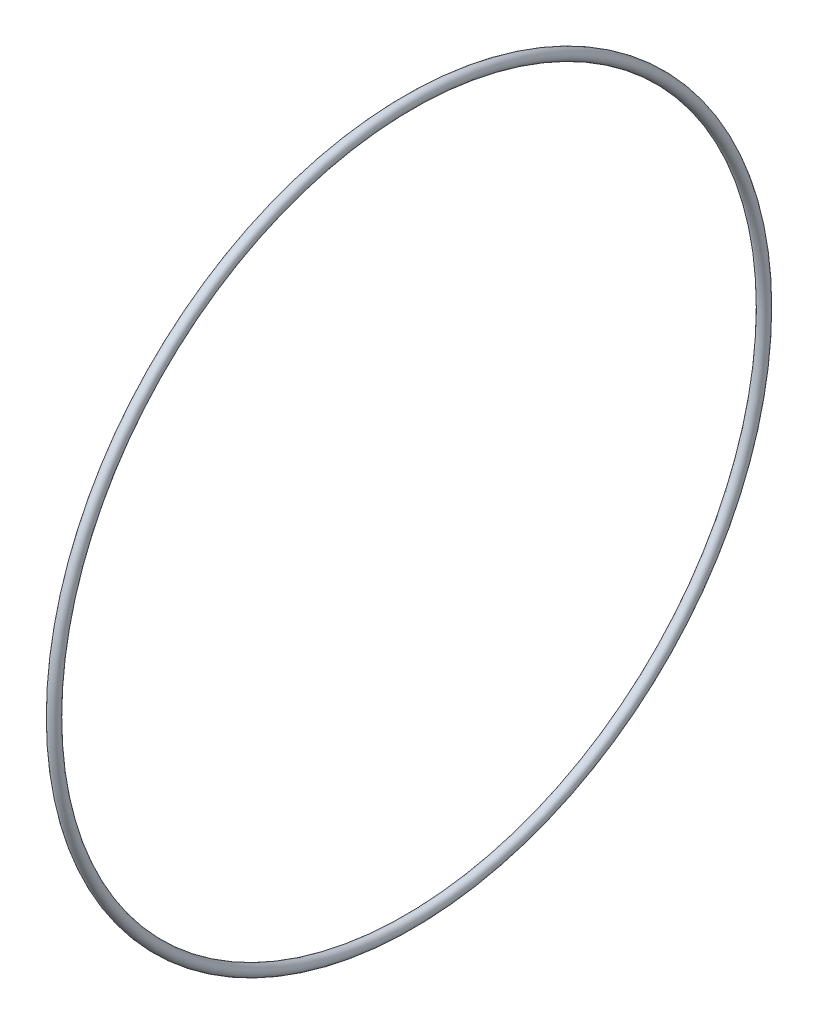
ISO-10303-21;
HEADER;
FILE_DESCRIPTION(('STEP AP214'),'2;1');
FILE_NAME('part.step','',(''),(''),'','','');
FILE_SCHEMA(('AUTOMOTIVE_DESIGN { 1 0 10303 214 1 1 1 1 }'));
ENDSEC;
DATA;
#1=APPLICATION_CONTEXT('core data for automotive mechanical design processes');
#2=APPLICATION_PROTOCOL_DEFINITION('international standard','automotive_design',2000,#1);
#3=PRODUCT_CONTEXT('',#1,'mechanical');
#4=PRODUCT('Part','Part','',(#3));
#5=PRODUCT_RELATED_PRODUCT_CATEGORY('part','',(#4));
#6=PRODUCT_DEFINITION_FORMATION('','',#4);
#7=PRODUCT_DEFINITION_CONTEXT('part definition',#1,'design');
#8=PRODUCT_DEFINITION('design','',#6,#7);
#9=PRODUCT_DEFINITION_SHAPE('','',#8);
#10=(LENGTH_UNIT() NAMED_UNIT(*) SI_UNIT(.MILLI.,.METRE.));
#11=(NAMED_UNIT(*) PLANE_ANGLE_UNIT() SI_UNIT($,.RADIAN.));
#12=(NAMED_UNIT(*) SI_UNIT($,.STERADIAN.) SOLID_ANGLE_UNIT());
#13=UNCERTAINTY_MEASURE_WITH_UNIT(LENGTH_MEASURE(1.E-05),#10,'distance_accuracy_value','');
#14=(GEOMETRIC_REPRESENTATION_CONTEXT(3) GLOBAL_UNCERTAINTY_ASSIGNED_CONTEXT((#13)) GLOBAL_UNIT_ASSIGNED_CONTEXT((#10,
#11,#12)) REPRESENTATION_CONTEXT('',''));
#15=CARTESIAN_POINT('',(0.,0.,0.));
#16=DIRECTION('',(0.,0.,1.));
#17=DIRECTION('',(1.,0.,0.));
#18=AXIS2_PLACEMENT_3D('',#15,#16,#17);
#19=CARTESIAN_POINT('',(0.,0.,0.));
#20=DIRECTION('',(-1.,0.,0.));
#21=DIRECTION('',(0.,0.,1.));
#22=AXIS2_PLACEMENT_3D('',#19,#20,#21);
#23=TOROIDAL_SURFACE('',#22,16.25,0.25);
#24=CARTESIAN_POINT('',(0.,0.,16.5));
#25=VERTEX_POINT('',#24);
#26=VERTEX_LOOP('',#25);
#27=FACE_BOUND('',#26,.T.);
#28=ADVANCED_FACE('F30',(#27),#23,.T.);
#29=CLOSED_SHELL('',(#28));
#30=MANIFOLD_SOLID_BREP('B2',#29);
#31=ADVANCED_BREP_SHAPE_REPRESENTATION('',(#18,#30),#14);
#32=SHAPE_DEFINITION_REPRESENTATION(#9,#31);
ENDSEC;
END-ISO-10303-21;
